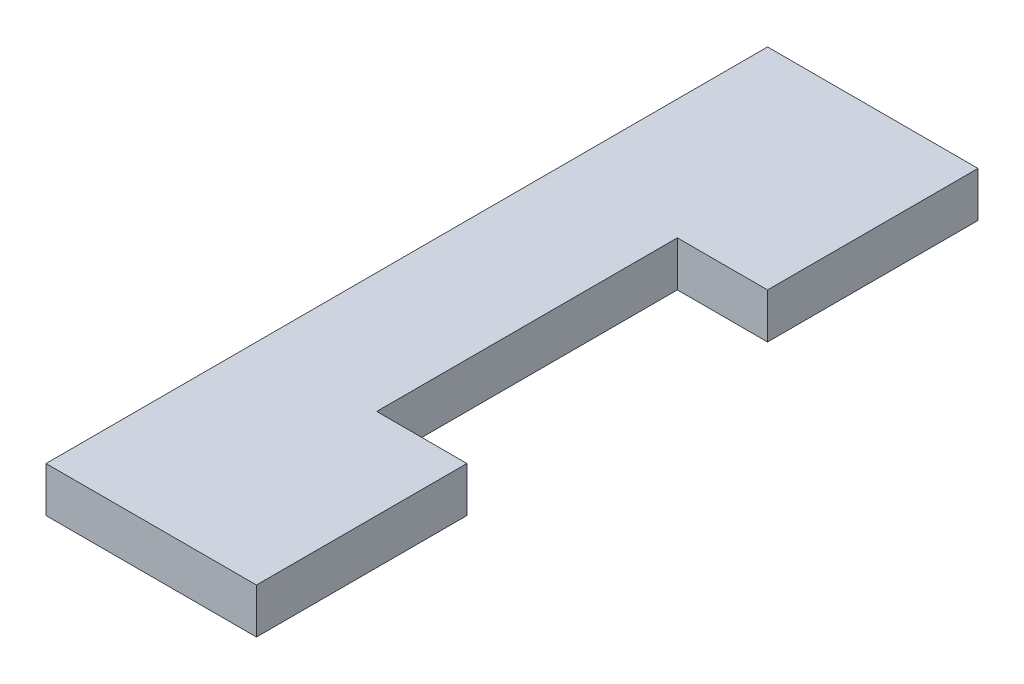
ISO-10303-21;
HEADER;
FILE_DESCRIPTION(('STEP AP214'),'2;1');
FILE_NAME('part.step','',(''),(''),'','','');
FILE_SCHEMA(('AUTOMOTIVE_DESIGN { 1 0 10303 214 1 1 1 1 }'));
ENDSEC;
DATA;
#1=APPLICATION_CONTEXT('core data for automotive mechanical design processes');
#2=APPLICATION_PROTOCOL_DEFINITION('international standard','automotive_design',2000,#1);
#3=PRODUCT_CONTEXT('',#1,'mechanical');
#4=PRODUCT('Part','Part','',(#3));
#5=PRODUCT_RELATED_PRODUCT_CATEGORY('part','',(#4));
#6=PRODUCT_DEFINITION_FORMATION('','',#4);
#7=PRODUCT_DEFINITION_CONTEXT('part definition',#1,'design');
#8=PRODUCT_DEFINITION('design','',#6,#7);
#9=PRODUCT_DEFINITION_SHAPE('','',#8);
#10=(LENGTH_UNIT() NAMED_UNIT(*) SI_UNIT(.MILLI.,.METRE.));
#11=(NAMED_UNIT(*) PLANE_ANGLE_UNIT() SI_UNIT($,.RADIAN.));
#12=(NAMED_UNIT(*) SI_UNIT($,.STERADIAN.) SOLID_ANGLE_UNIT());
#13=UNCERTAINTY_MEASURE_WITH_UNIT(LENGTH_MEASURE(1.E-05),#10,'distance_accuracy_value','');
#14=(GEOMETRIC_REPRESENTATION_CONTEXT(3) GLOBAL_UNCERTAINTY_ASSIGNED_CONTEXT((#13)) GLOBAL_UNIT_ASSIGNED_CONTEXT((#10,
#11,#12)) REPRESENTATION_CONTEXT('',''));
#15=CARTESIAN_POINT('',(0.,0.,0.));
#16=DIRECTION('',(0.,0.,1.));
#17=DIRECTION('',(1.,0.,0.));
#18=AXIS2_PLACEMENT_3D('',#15,#16,#17);
#19=CARTESIAN_POINT('',(88.9,19.05,0.));
#20=DIRECTION('',(0.,0.,-1.));
#21=DIRECTION('',(-1.,0.,0.));
#22=AXIS2_PLACEMENT_3D('',#19,#20,#21);
#23=PLANE('',#22);
#24=DIRECTION('',(1.,0.,0.));
#25=VECTOR('',#24,1.);
#26=CARTESIAN_POINT('',(88.9,0.,0.));
#27=LINE('',#26,#25);
#28=CARTESIAN_POINT('',(0.,0.,0.));
#29=VERTEX_POINT('',#28);
#30=CARTESIAN_POINT('',(88.9,0.,0.));
#31=VERTEX_POINT('',#30);
#32=EDGE_CURVE('E134',#29,#31,#27,.T.);
#33=ORIENTED_EDGE('',*,*,#32,.T.);
#34=DIRECTION('',(0.,-1.,0.));
#35=VECTOR('',#34,1.);
#36=CARTESIAN_POINT('',(88.9,19.05,0.));
#37=LINE('',#36,#35);
#38=CARTESIAN_POINT('',(88.9,19.05,0.));
#39=VERTEX_POINT('',#38);
#40=EDGE_CURVE('E11',#39,#31,#37,.T.);
#41=ORIENTED_EDGE('',*,*,#40,.F.);
#42=DIRECTION('',(1.,0.,0.));
#43=VECTOR('',#42,1.);
#44=CARTESIAN_POINT('',(88.9,19.05,0.));
#45=LINE('',#44,#43);
#46=CARTESIAN_POINT('',(0.,19.05,0.));
#47=VERTEX_POINT('',#46);
#48=EDGE_CURVE('E146',#47,#39,#45,.T.);
#49=ORIENTED_EDGE('',*,*,#48,.F.);
#50=DIRECTION('',(0.,-1.,0.));
#51=VECTOR('',#50,1.);
#52=CARTESIAN_POINT('',(0.,19.05,0.));
#53=LINE('',#52,#51);
#54=EDGE_CURVE('E131',#47,#29,#53,.T.);
#55=ORIENTED_EDGE('',*,*,#54,.T.);
#56=EDGE_LOOP('',(#33,#41,#49,#55));
#57=FACE_BOUND('',#56,.T.);
#58=ADVANCED_FACE('F39',(#57),#23,.F.);
#59=CARTESIAN_POINT('',(88.9,19.05,-88.9));
#60=DIRECTION('',(-1.,0.,0.));
#61=DIRECTION('',(0.,0.,1.));
#62=AXIS2_PLACEMENT_3D('',#59,#60,#61);
#63=PLANE('',#62);
#64=DIRECTION('',(0.,0.,-1.));
#65=VECTOR('',#64,1.);
#66=CARTESIAN_POINT('',(88.9,0.,-88.9));
#67=LINE('',#66,#65);
#68=CARTESIAN_POINT('',(88.9,0.,-88.9));
#69=VERTEX_POINT('',#68);
#70=EDGE_CURVE('E138',#31,#69,#67,.T.);
#71=ORIENTED_EDGE('',*,*,#70,.T.);
#72=DIRECTION('',(0.,-1.,0.));
#73=VECTOR('',#72,1.);
#74=CARTESIAN_POINT('',(88.9,19.05,-88.9));
#75=LINE('',#74,#73);
#76=CARTESIAN_POINT('',(88.9,19.05,-88.9));
#77=VERTEX_POINT('',#76);
#78=EDGE_CURVE('E50',#77,#69,#75,.T.);
#79=ORIENTED_EDGE('',*,*,#78,.F.);
#80=DIRECTION('',(0.,0.,-1.));
#81=VECTOR('',#80,1.);
#82=CARTESIAN_POINT('',(88.9,19.05,-88.9));
#83=LINE('',#82,#81);
#84=EDGE_CURVE('E97',#39,#77,#83,.T.);
#85=ORIENTED_EDGE('',*,*,#84,.F.);
#86=ORIENTED_EDGE('',*,*,#40,.T.);
#87=EDGE_LOOP('',(#71,#79,#85,#86));
#88=FACE_BOUND('',#87,.T.);
#89=ADVANCED_FACE('F182',(#88),#63,.F.);
#90=CARTESIAN_POINT('',(50.8,19.05,-88.9));
#91=DIRECTION('',(0.,0.,1.));
#92=DIRECTION('',(1.,0.,0.));
#93=AXIS2_PLACEMENT_3D('',#90,#91,#92);
#94=PLANE('',#93);
#95=DIRECTION('',(-1.,0.,0.));
#96=VECTOR('',#95,1.);
#97=CARTESIAN_POINT('',(50.8,0.,-88.9));
#98=LINE('',#97,#96);
#99=CARTESIAN_POINT('',(50.8,0.,-88.9));
#100=VERTEX_POINT('',#99);
#101=EDGE_CURVE('E139',#69,#100,#98,.T.);
#102=ORIENTED_EDGE('',*,*,#101,.T.);
#103=DIRECTION('',(0.,-1.,0.));
#104=VECTOR('',#103,1.);
#105=CARTESIAN_POINT('',(50.8,19.05,-88.9));
#106=LINE('',#105,#104);
#107=CARTESIAN_POINT('',(50.8,19.05,-88.9));
#108=VERTEX_POINT('',#107);
#109=EDGE_CURVE('E157',#108,#100,#106,.T.);
#110=ORIENTED_EDGE('',*,*,#109,.F.);
#111=DIRECTION('',(-1.,0.,0.));
#112=VECTOR('',#111,1.);
#113=CARTESIAN_POINT('',(50.8,19.05,-88.9));
#114=LINE('',#113,#112);
#115=EDGE_CURVE('E163',#77,#108,#114,.T.);
#116=ORIENTED_EDGE('',*,*,#115,.F.);
#117=ORIENTED_EDGE('',*,*,#78,.T.);
#118=EDGE_LOOP('',(#102,#110,#116,#117));
#119=FACE_BOUND('',#118,.T.);
#120=ADVANCED_FACE('F162',(#119),#94,.F.);
#121=CARTESIAN_POINT('',(50.8,19.05,-215.9));
#122=DIRECTION('',(-1.,0.,0.));
#123=DIRECTION('',(0.,0.,1.));
#124=AXIS2_PLACEMENT_3D('',#121,#122,#123);
#125=PLANE('',#124);
#126=DIRECTION('',(0.,0.,-1.));
#127=VECTOR('',#126,1.);
#128=CARTESIAN_POINT('',(50.8,0.,-215.9));
#129=LINE('',#128,#127);
#130=CARTESIAN_POINT('',(50.8,0.,-215.9));
#131=VERTEX_POINT('',#130);
#132=EDGE_CURVE('E145',#100,#131,#129,.T.);
#133=ORIENTED_EDGE('',*,*,#132,.T.);
#134=DIRECTION('',(0.,-1.,0.));
#135=VECTOR('',#134,1.);
#136=CARTESIAN_POINT('',(50.8,19.05,-215.9));
#137=LINE('',#136,#135);
#138=CARTESIAN_POINT('',(50.8,19.05,-215.9));
#139=VERTEX_POINT('',#138);
#140=EDGE_CURVE('E154',#139,#131,#137,.T.);
#141=ORIENTED_EDGE('',*,*,#140,.F.);
#142=DIRECTION('',(0.,0.,-1.));
#143=VECTOR('',#142,1.);
#144=CARTESIAN_POINT('',(50.8,19.05,-215.9));
#145=LINE('',#144,#143);
#146=EDGE_CURVE('E176',#108,#139,#145,.T.);
#147=ORIENTED_EDGE('',*,*,#146,.F.);
#148=ORIENTED_EDGE('',*,*,#109,.T.);
#149=EDGE_LOOP('',(#133,#141,#147,#148));
#150=FACE_BOUND('',#149,.T.);
#151=ADVANCED_FACE('F175',(#150),#125,.F.);
#152=CARTESIAN_POINT('',(88.9,19.05,-215.9));
#153=DIRECTION('',(0.,0.,-1.));
#154=DIRECTION('',(-1.,0.,0.));
#155=AXIS2_PLACEMENT_3D('',#152,#153,#154);
#156=PLANE('',#155);
#157=DIRECTION('',(1.,0.,0.));
#158=VECTOR('',#157,1.);
#159=CARTESIAN_POINT('',(88.9,0.,-215.9));
#160=LINE('',#159,#158);
#161=CARTESIAN_POINT('',(88.9,0.,-215.9));
#162=VERTEX_POINT('',#161);
#163=EDGE_CURVE('E143',#131,#162,#160,.T.);
#164=ORIENTED_EDGE('',*,*,#163,.T.);
#165=DIRECTION('',(0.,-1.,0.));
#166=VECTOR('',#165,1.);
#167=CARTESIAN_POINT('',(88.9,19.05,-215.9));
#168=LINE('',#167,#166);
#169=CARTESIAN_POINT('',(88.9,19.05,-215.9));
#170=VERTEX_POINT('',#169);
#171=EDGE_CURVE('E128',#170,#162,#168,.T.);
#172=ORIENTED_EDGE('',*,*,#171,.F.);
#173=DIRECTION('',(1.,0.,0.));
#174=VECTOR('',#173,1.);
#175=CARTESIAN_POINT('',(88.9,19.05,-215.9));
#176=LINE('',#175,#174);
#177=EDGE_CURVE('E117',#139,#170,#176,.T.);
#178=ORIENTED_EDGE('',*,*,#177,.F.);
#179=ORIENTED_EDGE('',*,*,#140,.T.);
#180=EDGE_LOOP('',(#164,#172,#178,#179));
#181=FACE_BOUND('',#180,.T.);
#182=ADVANCED_FACE('F172',(#181),#156,.F.);
#183=CARTESIAN_POINT('',(88.9,19.05,-304.8));
#184=DIRECTION('',(-1.,0.,0.));
#185=DIRECTION('',(0.,0.,1.));
#186=AXIS2_PLACEMENT_3D('',#183,#184,#185);
#187=PLANE('',#186);
#188=DIRECTION('',(0.,0.,-1.));
#189=VECTOR('',#188,1.);
#190=CARTESIAN_POINT('',(88.9,0.,-304.8));
#191=LINE('',#190,#189);
#192=CARTESIAN_POINT('',(88.9,0.,-304.8));
#193=VERTEX_POINT('',#192);
#194=EDGE_CURVE('E124',#162,#193,#191,.T.);
#195=ORIENTED_EDGE('',*,*,#194,.T.);
#196=DIRECTION('',(0.,-1.,0.));
#197=VECTOR('',#196,1.);
#198=CARTESIAN_POINT('',(88.9,19.05,-304.8));
#199=LINE('',#198,#197);
#200=CARTESIAN_POINT('',(88.9,19.05,-304.8));
#201=VERTEX_POINT('',#200);
#202=EDGE_CURVE('E122',#201,#193,#199,.T.);
#203=ORIENTED_EDGE('',*,*,#202,.F.);
#204=DIRECTION('',(0.,0.,-1.));
#205=VECTOR('',#204,1.);
#206=CARTESIAN_POINT('',(88.9,19.05,-304.8));
#207=LINE('',#206,#205);
#208=EDGE_CURVE('E112',#170,#201,#207,.T.);
#209=ORIENTED_EDGE('',*,*,#208,.F.);
#210=ORIENTED_EDGE('',*,*,#171,.T.);
#211=EDGE_LOOP('',(#195,#203,#209,#210));
#212=FACE_BOUND('',#211,.T.);
#213=ADVANCED_FACE('F121',(#212),#187,.F.);
#214=CARTESIAN_POINT('',(0.,19.05,-304.8));
#215=DIRECTION('',(0.,0.,1.));
#216=DIRECTION('',(1.,0.,0.));
#217=AXIS2_PLACEMENT_3D('',#214,#215,#216);
#218=PLANE('',#217);
#219=DIRECTION('',(-1.,0.,0.));
#220=VECTOR('',#219,1.);
#221=CARTESIAN_POINT('',(0.,0.,-304.8));
#222=LINE('',#221,#220);
#223=CARTESIAN_POINT('',(0.,0.,-304.8));
#224=VERTEX_POINT('',#223);
#225=EDGE_CURVE('E84',#193,#224,#222,.T.);
#226=ORIENTED_EDGE('',*,*,#225,.T.);
#227=DIRECTION('',(0.,-1.,0.));
#228=VECTOR('',#227,1.);
#229=CARTESIAN_POINT('',(0.,19.05,-304.8));
#230=LINE('',#229,#228);
#231=CARTESIAN_POINT('',(0.,19.05,-304.8));
#232=VERTEX_POINT('',#231);
#233=EDGE_CURVE('E130',#232,#224,#230,.T.);
#234=ORIENTED_EDGE('',*,*,#233,.F.);
#235=DIRECTION('',(-1.,0.,0.));
#236=VECTOR('',#235,1.);
#237=CARTESIAN_POINT('',(0.,19.05,-304.8));
#238=LINE('',#237,#236);
#239=EDGE_CURVE('E113',#201,#232,#238,.T.);
#240=ORIENTED_EDGE('',*,*,#239,.F.);
#241=ORIENTED_EDGE('',*,*,#202,.T.);
#242=EDGE_LOOP('',(#226,#234,#240,#241));
#243=FACE_BOUND('',#242,.T.);
#244=ADVANCED_FACE('F129',(#243),#218,.F.);
#245=CARTESIAN_POINT('',(0.,19.05,0.));
#246=DIRECTION('',(1.,0.,0.));
#247=DIRECTION('',(0.,0.,-1.));
#248=AXIS2_PLACEMENT_3D('',#245,#246,#247);
#249=PLANE('',#248);
#250=DIRECTION('',(0.,0.,1.));
#251=VECTOR('',#250,1.);
#252=CARTESIAN_POINT('',(0.,0.,0.));
#253=LINE('',#252,#251);
#254=EDGE_CURVE('E89',#224,#29,#253,.T.);
#255=ORIENTED_EDGE('',*,*,#254,.T.);
#256=ORIENTED_EDGE('',*,*,#54,.F.);
#257=DIRECTION('',(0.,0.,1.));
#258=VECTOR('',#257,1.);
#259=CARTESIAN_POINT('',(0.,19.05,0.));
#260=LINE('',#259,#258);
#261=EDGE_CURVE('E54',#232,#47,#260,.T.);
#262=ORIENTED_EDGE('',*,*,#261,.F.);
#263=ORIENTED_EDGE('',*,*,#233,.T.);
#264=EDGE_LOOP('',(#255,#256,#262,#263));
#265=FACE_BOUND('',#264,.T.);
#266=ADVANCED_FACE('F200',(#265),#249,.F.);
#267=CARTESIAN_POINT('',(0.,19.05,0.));
#268=DIRECTION('',(0.,-1.,0.));
#269=DIRECTION('',(0.,0.,-1.));
#270=AXIS2_PLACEMENT_3D('',#267,#268,#269);
#271=PLANE('',#270);
#272=ORIENTED_EDGE('',*,*,#48,.T.);
#273=ORIENTED_EDGE('',*,*,#84,.T.);
#274=ORIENTED_EDGE('',*,*,#115,.T.);
#275=ORIENTED_EDGE('',*,*,#146,.T.);
#276=ORIENTED_EDGE('',*,*,#177,.T.);
#277=ORIENTED_EDGE('',*,*,#208,.T.);
#278=ORIENTED_EDGE('',*,*,#239,.T.);
#279=ORIENTED_EDGE('',*,*,#261,.T.);
#280=EDGE_LOOP('',(#272,#273,#274,#275,#276,#277,#278,#279));
#281=FACE_BOUND('',#280,.T.);
#282=ADVANCED_FACE('F111',(#281),#271,.F.);
#283=CARTESIAN_POINT('',(0.,0.,0.));
#284=DIRECTION('',(0.,-1.,0.));
#285=DIRECTION('',(0.,0.,-1.));
#286=AXIS2_PLACEMENT_3D('',#283,#284,#285);
#287=PLANE('',#286);
#288=ORIENTED_EDGE('',*,*,#32,.F.);
#289=ORIENTED_EDGE('',*,*,#254,.F.);
#290=ORIENTED_EDGE('',*,*,#225,.F.);
#291=ORIENTED_EDGE('',*,*,#194,.F.);
#292=ORIENTED_EDGE('',*,*,#163,.F.);
#293=ORIENTED_EDGE('',*,*,#132,.F.);
#294=ORIENTED_EDGE('',*,*,#101,.F.);
#295=ORIENTED_EDGE('',*,*,#70,.F.);
#296=EDGE_LOOP('',(#288,#289,#290,#291,#292,#293,#294,#295));
#297=FACE_BOUND('',#296,.T.);
#298=ADVANCED_FACE('F166',(#297),#287,.T.);
#299=CLOSED_SHELL('',(#58,#89,#120,#151,#182,#213,#244,#266,#282,#298));
#300=MANIFOLD_SOLID_BREP('B2',#299);
#301=ADVANCED_BREP_SHAPE_REPRESENTATION('',(#18,#300),#14);
#302=SHAPE_DEFINITION_REPRESENTATION(#9,#301);
ENDSEC;
END-ISO-10303-21;
